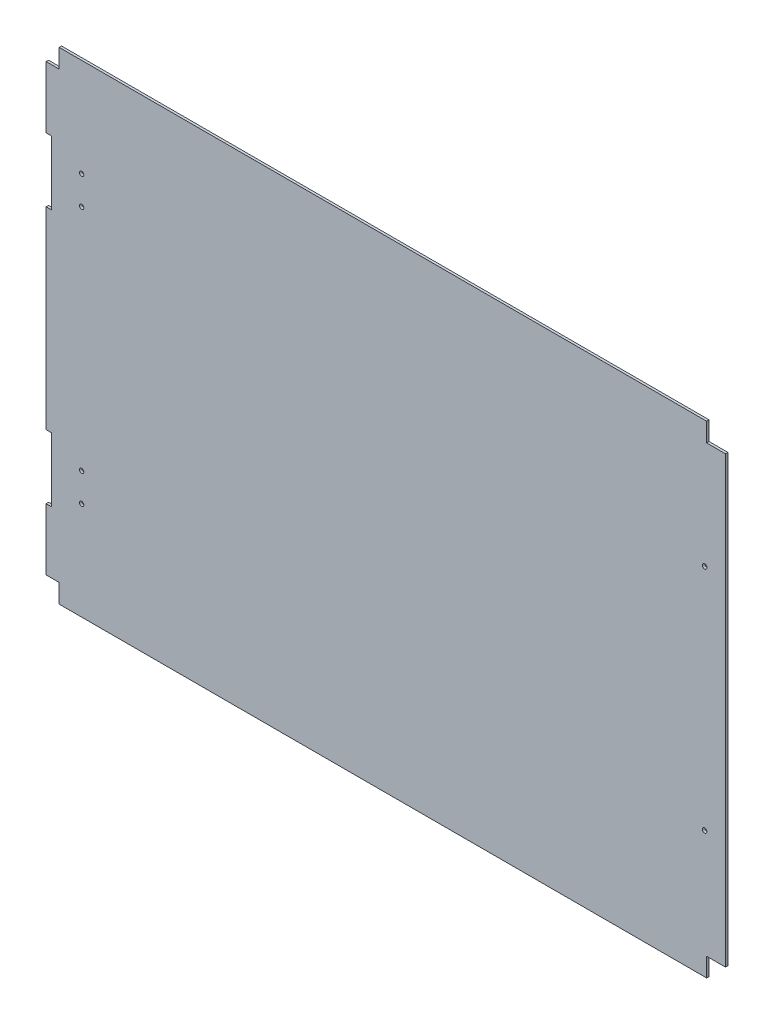
ISO-10303-21;
HEADER;
FILE_DESCRIPTION(('STEP AP214'),'2;1');
FILE_NAME('part.step','',(''),(''),'','','');
FILE_SCHEMA(('AUTOMOTIVE_DESIGN { 1 0 10303 214 1 1 1 1 }'));
ENDSEC;
DATA;
#1=APPLICATION_CONTEXT('core data for automotive mechanical design processes');
#2=APPLICATION_PROTOCOL_DEFINITION('international standard','automotive_design',2000,#1);
#3=PRODUCT_CONTEXT('',#1,'mechanical');
#4=PRODUCT('Part','Part','',(#3));
#5=PRODUCT_RELATED_PRODUCT_CATEGORY('part','',(#4));
#6=PRODUCT_DEFINITION_FORMATION('','',#4);
#7=PRODUCT_DEFINITION_CONTEXT('part definition',#1,'design');
#8=PRODUCT_DEFINITION('design','',#6,#7);
#9=PRODUCT_DEFINITION_SHAPE('','',#8);
#10=(LENGTH_UNIT() NAMED_UNIT(*) SI_UNIT(.MILLI.,.METRE.));
#11=(NAMED_UNIT(*) PLANE_ANGLE_UNIT() SI_UNIT($,.RADIAN.));
#12=(NAMED_UNIT(*) SI_UNIT($,.STERADIAN.) SOLID_ANGLE_UNIT());
#13=UNCERTAINTY_MEASURE_WITH_UNIT(LENGTH_MEASURE(1.E-05),#10,'distance_accuracy_value','');
#14=(GEOMETRIC_REPRESENTATION_CONTEXT(3) GLOBAL_UNCERTAINTY_ASSIGNED_CONTEXT((#13)) GLOBAL_UNIT_ASSIGNED_CONTEXT((#10,
#11,#12)) REPRESENTATION_CONTEXT('',''));
#15=CARTESIAN_POINT('',(0.,0.,0.));
#16=DIRECTION('',(0.,0.,1.));
#17=DIRECTION('',(1.,0.,0.));
#18=AXIS2_PLACEMENT_3D('',#15,#16,#17);
#19=CARTESIAN_POINT('',(359.537,253.238,-19.05));
#20=DIRECTION('',(-1.,0.,0.));
#21=DIRECTION('',(0.,0.,1.));
#22=AXIS2_PLACEMENT_3D('',#19,#20,#21);
#23=PLANE('',#22);
#24=DIRECTION('',(0.,1.,0.));
#25=VECTOR('',#24,1.);
#26=CARTESIAN_POINT('',(359.537,0.,-2.667));
#27=LINE('',#26,#25);
#28=CARTESIAN_POINT('',(359.537,246.888,-2.667));
#29=VERTEX_POINT('',#28);
#30=CARTESIAN_POINT('',(359.537,267.778291291236,-2.66699999999986));
#31=VERTEX_POINT('',#30);
#32=EDGE_CURVE('E290',#29,#31,#27,.T.);
#33=ORIENTED_EDGE('',*,*,#32,.T.);
#34=DIRECTION('',(0.,0.,-1.));
#35=VECTOR('',#34,1.);
#36=CARTESIAN_POINT('',(359.537,267.778291291236,0.));
#37=LINE('',#36,#35);
#38=CARTESIAN_POINT('',(359.537,267.778291291236,0.));
#39=VERTEX_POINT('',#38);
#40=EDGE_CURVE('E288',#39,#31,#37,.T.);
#41=ORIENTED_EDGE('',*,*,#40,.F.);
#42=DIRECTION('',(0.,-1.,0.));
#43=VECTOR('',#42,1.);
#44=CARTESIAN_POINT('',(359.537,253.238,0.));
#45=LINE('',#44,#43);
#46=CARTESIAN_POINT('',(359.537,246.888,0.));
#47=VERTEX_POINT('',#46);
#48=EDGE_CURVE('E276',#39,#47,#45,.T.);
#49=ORIENTED_EDGE('',*,*,#48,.T.);
#50=DIRECTION('',(0.,0.,1.));
#51=VECTOR('',#50,1.);
#52=CARTESIAN_POINT('',(359.537,246.888,-19.05));
#53=LINE('',#52,#51);
#54=EDGE_CURVE('E486',#29,#47,#53,.T.);
#55=ORIENTED_EDGE('',*,*,#54,.F.);
#56=EDGE_LOOP('',(#33,#41,#49,#55));
#57=FACE_BOUND('',#56,.T.);
#58=ADVANCED_FACE('F136',(#57),#23,.F.);
#59=CARTESIAN_POINT('',(365.887,246.888,-19.05));
#60=DIRECTION('',(0.,-1.,0.));
#61=DIRECTION('',(0.,0.,-1.));
#62=AXIS2_PLACEMENT_3D('',#59,#60,#61);
#63=PLANE('',#62);
#64=DIRECTION('',(1.,0.,0.));
#65=VECTOR('',#64,1.);
#66=CARTESIAN_POINT('',(365.887,246.888,0.));
#67=LINE('',#66,#65);
#68=CARTESIAN_POINT('',(380.427291291236,246.888,1.11022302462516E-13));
#69=VERTEX_POINT('',#68);
#70=EDGE_CURVE('E282',#47,#69,#67,.T.);
#71=ORIENTED_EDGE('',*,*,#70,.T.);
#72=DIRECTION('',(0.,0.,1.));
#73=VECTOR('',#72,1.);
#74=CARTESIAN_POINT('',(380.427291291236,246.888,1.11022302462516E-13));
#75=LINE('',#74,#73);
#76=CARTESIAN_POINT('',(380.427291291236,246.888,-2.66699999999986));
#77=VERTEX_POINT('',#76);
#78=EDGE_CURVE('E318',#77,#69,#75,.T.);
#79=ORIENTED_EDGE('',*,*,#78,.F.);
#80=DIRECTION('',(-1.,0.,0.));
#81=VECTOR('',#80,1.);
#82=CARTESIAN_POINT('',(0.,246.888,-2.667));
#83=LINE('',#82,#81);
#84=EDGE_CURVE('E152',#77,#29,#83,.T.);
#85=ORIENTED_EDGE('',*,*,#84,.T.);
#86=ORIENTED_EDGE('',*,*,#54,.T.);
#87=EDGE_LOOP('',(#71,#79,#85,#86));
#88=FACE_BOUND('',#87,.T.);
#89=ADVANCED_FACE('F564',(#88),#63,.F.);
#90=CARTESIAN_POINT('',(365.887,-246.888,-19.05));
#91=DIRECTION('',(0.,1.,0.));
#92=DIRECTION('',(0.,0.,1.));
#93=AXIS2_PLACEMENT_3D('',#90,#91,#92);
#94=PLANE('',#93);
#95=DIRECTION('',(1.,0.,0.));
#96=VECTOR('',#95,1.);
#97=CARTESIAN_POINT('',(0.,-246.888,-2.667));
#98=LINE('',#97,#96);
#99=CARTESIAN_POINT('',(359.537,-246.888,-2.667));
#100=VERTEX_POINT('',#99);
#101=CARTESIAN_POINT('',(380.427291291236,-246.888,-2.66699999999986));
#102=VERTEX_POINT('',#101);
#103=EDGE_CURVE('E502',#100,#102,#98,.T.);
#104=ORIENTED_EDGE('',*,*,#103,.T.);
#105=DIRECTION('',(0.,0.,-1.));
#106=VECTOR('',#105,1.);
#107=CARTESIAN_POINT('',(380.427291291236,-246.888,0.));
#108=LINE('',#107,#106);
#109=CARTESIAN_POINT('',(380.427291291236,-246.888,0.));
#110=VERTEX_POINT('',#109);
#111=EDGE_CURVE('E301',#110,#102,#108,.T.);
#112=ORIENTED_EDGE('',*,*,#111,.F.);
#113=DIRECTION('',(-1.,0.,0.));
#114=VECTOR('',#113,1.);
#115=CARTESIAN_POINT('',(365.887,-246.888,0.));
#116=LINE('',#115,#114);
#117=CARTESIAN_POINT('',(359.537,-246.888,0.));
#118=VERTEX_POINT('',#117);
#119=EDGE_CURVE('E468',#110,#118,#116,.T.);
#120=ORIENTED_EDGE('',*,*,#119,.T.);
#121=DIRECTION('',(0.,0.,1.));
#122=VECTOR('',#121,1.);
#123=CARTESIAN_POINT('',(359.537,-246.888,-19.05));
#124=LINE('',#123,#122);
#125=EDGE_CURVE('E473',#100,#118,#124,.T.);
#126=ORIENTED_EDGE('',*,*,#125,.F.);
#127=EDGE_LOOP('',(#104,#112,#120,#126));
#128=FACE_BOUND('',#127,.T.);
#129=ADVANCED_FACE('F568',(#128),#94,.F.);
#130=CARTESIAN_POINT('',(359.537,-253.238,-19.05));
#131=DIRECTION('',(-1.,0.,0.));
#132=DIRECTION('',(0.,-1.,0.));
#133=AXIS2_PLACEMENT_3D('',#130,#131,#132);
#134=PLANE('',#133);
#135=DIRECTION('',(0.,-1.,0.));
#136=VECTOR('',#135,1.);
#137=CARTESIAN_POINT('',(359.537,-253.238,0.));
#138=LINE('',#137,#136);
#139=CARTESIAN_POINT('',(359.537,-267.778291291236,1.11022302462516E-13));
#140=VERTEX_POINT('',#139);
#141=EDGE_CURVE('E476',#118,#140,#138,.T.);
#142=ORIENTED_EDGE('',*,*,#141,.T.);
#143=DIRECTION('',(0.,0.,1.));
#144=VECTOR('',#143,1.);
#145=CARTESIAN_POINT('',(359.537,-267.778291291236,2.22044604925031E-13));
#146=LINE('',#145,#144);
#147=CARTESIAN_POINT('',(359.537,-267.778291291236,-2.66699999999986));
#148=VERTEX_POINT('',#147);
#149=EDGE_CURVE('E334',#148,#140,#146,.T.);
#150=ORIENTED_EDGE('',*,*,#149,.F.);
#151=DIRECTION('',(0.,1.,0.));
#152=VECTOR('',#151,1.);
#153=CARTESIAN_POINT('',(359.536999999996,6.2860827654276E-12,-2.667));
#154=LINE('',#153,#152);
#155=EDGE_CURVE('E160',#148,#100,#154,.T.);
#156=ORIENTED_EDGE('',*,*,#155,.T.);
#157=ORIENTED_EDGE('',*,*,#125,.T.);
#158=EDGE_LOOP('',(#142,#150,#156,#157));
#159=FACE_BOUND('',#158,.T.);
#160=ADVANCED_FACE('F576',(#159),#134,.F.);
#161=CARTESIAN_POINT('',(-359.537,-253.238,-19.05));
#162=DIRECTION('',(1.,0.,0.));
#163=DIRECTION('',(0.,1.,0.));
#164=AXIS2_PLACEMENT_3D('',#161,#162,#163);
#165=PLANE('',#164);
#166=DIRECTION('',(0.,-1.,0.));
#167=VECTOR('',#166,1.);
#168=CARTESIAN_POINT('',(-359.536999999998,3.14304138271379E-12,-2.667));
#169=LINE('',#168,#167);
#170=CARTESIAN_POINT('',(-359.537,-246.888,-2.667));
#171=VERTEX_POINT('',#170);
#172=CARTESIAN_POINT('',(-359.537,-267.778291291236,-2.66699999999986));
#173=VERTEX_POINT('',#172);
#174=EDGE_CURVE('E495',#171,#173,#169,.T.);
#175=ORIENTED_EDGE('',*,*,#174,.T.);
#176=DIRECTION('',(0.,0.,-1.));
#177=VECTOR('',#176,1.);
#178=CARTESIAN_POINT('',(-359.537,-267.778291291236,0.));
#179=LINE('',#178,#177);
#180=CARTESIAN_POINT('',(-359.537,-267.778291291236,0.));
#181=VERTEX_POINT('',#180);
#182=EDGE_CURVE('E330',#181,#173,#179,.T.);
#183=ORIENTED_EDGE('',*,*,#182,.F.);
#184=DIRECTION('',(0.,1.,0.));
#185=VECTOR('',#184,1.);
#186=CARTESIAN_POINT('',(-359.537,-253.238,0.));
#187=LINE('',#186,#185);
#188=CARTESIAN_POINT('',(-359.537,-246.888,0.));
#189=VERTEX_POINT('',#188);
#190=EDGE_CURVE('E457',#181,#189,#187,.T.);
#191=ORIENTED_EDGE('',*,*,#190,.T.);
#192=DIRECTION('',(0.,0.,1.));
#193=VECTOR('',#192,1.);
#194=CARTESIAN_POINT('',(-359.537,-246.888,-19.05));
#195=LINE('',#194,#193);
#196=EDGE_CURVE('E463',#171,#189,#195,.T.);
#197=ORIENTED_EDGE('',*,*,#196,.F.);
#198=EDGE_LOOP('',(#175,#183,#191,#197));
#199=FACE_BOUND('',#198,.T.);
#200=ADVANCED_FACE('F579',(#199),#165,.F.);
#201=CARTESIAN_POINT('',(-365.887,-246.888,-19.05));
#202=DIRECTION('',(0.,1.,0.));
#203=DIRECTION('',(0.,0.,1.));
#204=AXIS2_PLACEMENT_3D('',#201,#202,#203);
#205=PLANE('',#204);
#206=DIRECTION('',(-1.,0.,0.));
#207=VECTOR('',#206,1.);
#208=CARTESIAN_POINT('',(-365.887,-246.888,0.));
#209=LINE('',#208,#207);
#210=CARTESIAN_POINT('',(-374.077291291236,-246.888,0.));
#211=VERTEX_POINT('',#210);
#212=EDGE_CURVE('E467',#189,#211,#209,.T.);
#213=ORIENTED_EDGE('',*,*,#212,.T.);
#214=DIRECTION('',(0.,0.,1.));
#215=VECTOR('',#214,1.);
#216=CARTESIAN_POINT('',(-374.077291291236,-246.888,0.));
#217=LINE('',#216,#215);
#218=CARTESIAN_POINT('',(-374.077291291236,-246.888,-2.66699999999992));
#219=VERTEX_POINT('',#218);
#220=EDGE_CURVE('E404',#219,#211,#217,.T.);
#221=ORIENTED_EDGE('',*,*,#220,.F.);
#222=DIRECTION('',(1.,0.,0.));
#223=VECTOR('',#222,1.);
#224=CARTESIAN_POINT('',(0.,-246.888,-2.667));
#225=LINE('',#224,#223);
#226=EDGE_CURVE('E492',#219,#171,#225,.T.);
#227=ORIENTED_EDGE('',*,*,#226,.T.);
#228=ORIENTED_EDGE('',*,*,#196,.T.);
#229=EDGE_LOOP('',(#213,#221,#227,#228));
#230=FACE_BOUND('',#229,.T.);
#231=ADVANCED_FACE('F582',(#230),#205,.F.);
#232=CARTESIAN_POINT('',(-365.887,246.888,-19.05));
#233=DIRECTION('',(0.,-1.,0.));
#234=DIRECTION('',(1.,0.,0.));
#235=AXIS2_PLACEMENT_3D('',#232,#233,#234);
#236=PLANE('',#235);
#237=DIRECTION('',(-1.,0.,0.));
#238=VECTOR('',#237,1.);
#239=CARTESIAN_POINT('',(-1.07913677993566E-12,246.888000000002,-2.667));
#240=LINE('',#239,#238);
#241=CARTESIAN_POINT('',(-359.537,246.888,-2.667));
#242=VERTEX_POINT('',#241);
#243=CARTESIAN_POINT('',(-374.077291291236,246.888,-2.66699999999992));
#244=VERTEX_POINT('',#243);
#245=EDGE_CURVE('E489',#242,#244,#240,.T.);
#246=ORIENTED_EDGE('',*,*,#245,.T.);
#247=DIRECTION('',(0.,0.,-1.));
#248=VECTOR('',#247,1.);
#249=CARTESIAN_POINT('',(-374.077291291236,246.888,2.22044604925031E-12));
#250=LINE('',#249,#248);
#251=CARTESIAN_POINT('',(-374.077291291236,246.888,1.11022302462516E-13));
#252=VERTEX_POINT('',#251);
#253=EDGE_CURVE('E392',#252,#244,#250,.T.);
#254=ORIENTED_EDGE('',*,*,#253,.F.);
#255=DIRECTION('',(1.,0.,0.));
#256=VECTOR('',#255,1.);
#257=CARTESIAN_POINT('',(-365.887,246.888,0.));
#258=LINE('',#257,#256);
#259=CARTESIAN_POINT('',(-359.537,246.888,0.));
#260=VERTEX_POINT('',#259);
#261=EDGE_CURVE('E285',#252,#260,#258,.T.);
#262=ORIENTED_EDGE('',*,*,#261,.T.);
#263=DIRECTION('',(0.,0.,1.));
#264=VECTOR('',#263,1.);
#265=CARTESIAN_POINT('',(-359.537,246.888,-19.05));
#266=LINE('',#265,#264);
#267=EDGE_CURVE('E453',#242,#260,#266,.T.);
#268=ORIENTED_EDGE('',*,*,#267,.F.);
#269=EDGE_LOOP('',(#246,#254,#262,#268));
#270=FACE_BOUND('',#269,.T.);
#271=ADVANCED_FACE('F573',(#270),#236,.F.);
#272=CARTESIAN_POINT('',(-359.537,253.238,-19.05));
#273=DIRECTION('',(1.,0.,0.));
#274=DIRECTION('',(0.,1.,0.));
#275=AXIS2_PLACEMENT_3D('',#272,#273,#274);
#276=PLANE('',#275);
#277=DIRECTION('',(0.,1.,0.));
#278=VECTOR('',#277,1.);
#279=CARTESIAN_POINT('',(-359.537,253.238,0.));
#280=LINE('',#279,#278);
#281=CARTESIAN_POINT('',(-359.537,267.778291291236,0.));
#282=VERTEX_POINT('',#281);
#283=EDGE_CURVE('E456',#260,#282,#280,.T.);
#284=ORIENTED_EDGE('',*,*,#283,.T.);
#285=DIRECTION('',(0.,0.,1.));
#286=VECTOR('',#285,1.);
#287=CARTESIAN_POINT('',(-359.537,267.778291291236,1.66533453693773E-13));
#288=LINE('',#287,#286);
#289=CARTESIAN_POINT('',(-359.537,267.778291291236,-2.66699999999986));
#290=VERTEX_POINT('',#289);
#291=EDGE_CURVE('E295',#290,#282,#288,.T.);
#292=ORIENTED_EDGE('',*,*,#291,.F.);
#293=DIRECTION('',(0.,-1.,0.));
#294=VECTOR('',#293,1.);
#295=CARTESIAN_POINT('',(-359.536999999998,-3.14304138271379E-12,-2.667));
#296=LINE('',#295,#294);
#297=EDGE_CURVE('E507',#290,#242,#296,.T.);
#298=ORIENTED_EDGE('',*,*,#297,.T.);
#299=ORIENTED_EDGE('',*,*,#267,.T.);
#300=EDGE_LOOP('',(#284,#292,#298,#299));
#301=FACE_BOUND('',#300,.T.);
#302=ADVANCED_FACE('F536',(#301),#276,.F.);
#303=CARTESIAN_POINT('',(0.,0.,-2.667));
#304=DIRECTION('',(0.,0.,-1.));
#305=DIRECTION('',(-1.,0.,0.));
#306=AXIS2_PLACEMENT_3D('',#303,#304,#305);
#307=PLANE('',#306);
#308=CARTESIAN_POINT('',(-334.645,127.,-2.667));
#309=DIRECTION('',(0.,0.,-1.));
#310=DIRECTION('',(-1.,0.,0.));
#311=AXIS2_PLACEMENT_3D('',#308,#309,#310);
#312=CIRCLE('',#311,2.413);
#313=CARTESIAN_POINT('',(-337.058,127.,-2.667));
#314=VERTEX_POINT('',#313);
#315=EDGE_CURVE('E13',#314,#314,#312,.T.);
#316=ORIENTED_EDGE('',*,*,#315,.F.);
#317=EDGE_LOOP('',(#316));
#318=FACE_BOUND('',#317,.T.);
#319=CARTESIAN_POINT('',(-334.645,-127.,-2.667));
#320=DIRECTION('',(0.,0.,-1.));
#321=DIRECTION('',(-1.,0.,0.));
#322=AXIS2_PLACEMENT_3D('',#319,#320,#321);
#323=CIRCLE('',#322,2.413);
#324=CARTESIAN_POINT('',(-337.058,-127.,-2.667));
#325=VERTEX_POINT('',#324);
#326=EDGE_CURVE('E145',#325,#325,#323,.T.);
#327=ORIENTED_EDGE('',*,*,#326,.F.);
#328=EDGE_LOOP('',(#327));
#329=FACE_BOUND('',#328,.T.);
#330=CARTESIAN_POINT('',(-334.645,-158.75,-2.667));
#331=DIRECTION('',(0.,0.,-1.));
#332=DIRECTION('',(-1.,0.,0.));
#333=AXIS2_PLACEMENT_3D('',#330,#331,#332);
#334=CIRCLE('',#333,2.413);
#335=CARTESIAN_POINT('',(-337.058,-158.75,-2.667));
#336=VERTEX_POINT('',#335);
#337=EDGE_CURVE('E522',#336,#336,#334,.T.);
#338=ORIENTED_EDGE('',*,*,#337,.F.);
#339=EDGE_LOOP('',(#338));
#340=FACE_BOUND('',#339,.T.);
#341=CARTESIAN_POINT('',(357.251,127.,-2.667));
#342=DIRECTION('',(0.,0.,-1.));
#343=DIRECTION('',(-1.,0.,0.));
#344=AXIS2_PLACEMENT_3D('',#341,#342,#343);
#345=CIRCLE('',#344,2.54000000000001);
#346=CARTESIAN_POINT('',(354.711,127.,-2.667));
#347=VERTEX_POINT('',#346);
#348=EDGE_CURVE('E518',#347,#347,#345,.T.);
#349=ORIENTED_EDGE('',*,*,#348,.F.);
#350=EDGE_LOOP('',(#349));
#351=FACE_BOUND('',#350,.T.);
#352=CARTESIAN_POINT('',(-334.645,158.75,-2.667));
#353=DIRECTION('',(0.,0.,-1.));
#354=DIRECTION('',(-1.,0.,0.));
#355=AXIS2_PLACEMENT_3D('',#352,#353,#354);
#356=CIRCLE('',#355,2.413);
#357=CARTESIAN_POINT('',(-337.058,158.75,-2.667));
#358=VERTEX_POINT('',#357);
#359=EDGE_CURVE('E514',#358,#358,#356,.T.);
#360=ORIENTED_EDGE('',*,*,#359,.F.);
#361=EDGE_LOOP('',(#360));
#362=FACE_BOUND('',#361,.T.);
#363=ORIENTED_EDGE('',*,*,#155,.F.);
#364=DIRECTION('',(-1.,0.,0.));
#365=VECTOR('',#364,1.);
#366=CARTESIAN_POINT('',(365.887,-267.778291291236,-2.66699999999986));
#367=LINE('',#366,#365);
#368=EDGE_CURVE('E317',#173,#148,#367,.F.);
#369=ORIENTED_EDGE('',*,*,#368,.F.);
#370=ORIENTED_EDGE('',*,*,#174,.F.);
#371=ORIENTED_EDGE('',*,*,#226,.F.);
#372=DIRECTION('',(0.,1.,0.));
#373=VECTOR('',#372,1.);
#374=CARTESIAN_POINT('',(-374.077291291236,-247.904,-2.66699999999992));
#375=LINE('',#374,#373);
#376=CARTESIAN_POINT('',(-374.077291291236,-178.308,-2.66699999999992));
#377=VERTEX_POINT('',#376);
#378=EDGE_CURVE('E405',#377,#219,#375,.F.);
#379=ORIENTED_EDGE('',*,*,#378,.F.);
#380=DIRECTION('',(1.,0.,0.));
#381=VECTOR('',#380,1.);
#382=CARTESIAN_POINT('',(-374.077291291236,-178.308,-2.66699999999992));
#383=LINE('',#382,#381);
#384=CARTESIAN_POINT('',(-368.235291291236,-178.308,-2.66700000000009));
#385=VERTEX_POINT('',#384);
#386=EDGE_CURVE('E356',#377,#385,#383,.T.);
#387=ORIENTED_EDGE('',*,*,#386,.T.);
#388=DIRECTION('',(0.,1.,0.));
#389=VECTOR('',#388,1.);
#390=CARTESIAN_POINT('',(-368.235291291236,-178.308,-2.66700000000009));
#391=LINE('',#390,#389);
#392=CARTESIAN_POINT('',(-368.235291291236,-107.188,-2.66700000000009));
#393=VERTEX_POINT('',#392);
#394=EDGE_CURVE('E352',#385,#393,#391,.T.);
#395=ORIENTED_EDGE('',*,*,#394,.T.);
#396=DIRECTION('',(-1.,0.,0.));
#397=VECTOR('',#396,1.);
#398=CARTESIAN_POINT('',(-374.077291291236,-107.188,-2.66699999999992));
#399=LINE('',#398,#397);
#400=CARTESIAN_POINT('',(-374.077291291236,-107.188,-2.66699999999992));
#401=VERTEX_POINT('',#400);
#402=EDGE_CURVE('E348',#393,#401,#399,.T.);
#403=ORIENTED_EDGE('',*,*,#402,.T.);
#404=CARTESIAN_POINT('',(-374.077291291236,107.188,-2.66699999999992));
#405=VERTEX_POINT('',#404);
#406=EDGE_CURVE('E329',#405,#401,#375,.F.);
#407=ORIENTED_EDGE('',*,*,#406,.F.);
#408=DIRECTION('',(1.,0.,0.));
#409=VECTOR('',#408,1.);
#410=CARTESIAN_POINT('',(-374.077291291236,107.188,-2.66699999999992));
#411=LINE('',#410,#409);
#412=CARTESIAN_POINT('',(-368.235291291236,107.188,-2.66700000000009));
#413=VERTEX_POINT('',#412);
#414=EDGE_CURVE('E368',#405,#413,#411,.T.);
#415=ORIENTED_EDGE('',*,*,#414,.T.);
#416=DIRECTION('',(0.,1.,0.));
#417=VECTOR('',#416,1.);
#418=CARTESIAN_POINT('',(-368.235291291236,178.308,-2.66700000000009));
#419=LINE('',#418,#417);
#420=CARTESIAN_POINT('',(-368.235291291236,178.308,-2.66700000000009));
#421=VERTEX_POINT('',#420);
#422=EDGE_CURVE('E364',#413,#421,#419,.T.);
#423=ORIENTED_EDGE('',*,*,#422,.T.);
#424=DIRECTION('',(-1.,0.,0.));
#425=VECTOR('',#424,1.);
#426=CARTESIAN_POINT('',(-374.077291291236,178.308,-2.66699999999992));
#427=LINE('',#426,#425);
#428=CARTESIAN_POINT('',(-374.077291291236,178.308,-2.66699999999992));
#429=VERTEX_POINT('',#428);
#430=EDGE_CURVE('E360',#421,#429,#427,.T.);
#431=ORIENTED_EDGE('',*,*,#430,.T.);
#432=EDGE_CURVE('E400',#244,#429,#375,.F.);
#433=ORIENTED_EDGE('',*,*,#432,.F.);
#434=ORIENTED_EDGE('',*,*,#245,.F.);
#435=ORIENTED_EDGE('',*,*,#297,.F.);
#436=DIRECTION('',(1.,0.,0.));
#437=VECTOR('',#436,1.);
#438=CARTESIAN_POINT('',(-365.887,267.778291291236,-2.66699999999986));
#439=LINE('',#438,#437);
#440=EDGE_CURVE('E311',#31,#290,#439,.F.);
#441=ORIENTED_EDGE('',*,*,#440,.F.);
#442=ORIENTED_EDGE('',*,*,#32,.F.);
#443=ORIENTED_EDGE('',*,*,#84,.F.);
#444=DIRECTION('',(0.,-1.,0.));
#445=VECTOR('',#444,1.);
#446=CARTESIAN_POINT('',(380.427291291236,253.238,-2.66699999999986));
#447=LINE('',#446,#445);
#448=EDGE_CURVE('E306',#102,#77,#447,.F.);
#449=ORIENTED_EDGE('',*,*,#448,.F.);
#450=ORIENTED_EDGE('',*,*,#103,.F.);
#451=EDGE_LOOP('',(#363,#369,#370,#371,#379,#387,#395,#403,#407,#415,#423,#431,#433,#434,#435,
#441,#442,#443,#449,#450));
#452=FACE_BOUND('',#451,.T.);
#453=CARTESIAN_POINT('',(357.251,-127.,-2.667));
#454=DIRECTION('',(0.,0.,-1.));
#455=DIRECTION('',(-1.,0.,0.));
#456=AXIS2_PLACEMENT_3D('',#453,#454,#455);
#457=CIRCLE('',#456,2.54000000000001);
#458=CARTESIAN_POINT('',(354.711,-127.,-2.667));
#459=VERTEX_POINT('',#458);
#460=EDGE_CURVE('E510',#459,#459,#457,.T.);
#461=ORIENTED_EDGE('',*,*,#460,.F.);
#462=EDGE_LOOP('',(#461));
#463=FACE_BOUND('',#462,.T.);
#464=ADVANCED_FACE('F533',(#318,#329,#340,#351,#362,#452,#463),#307,.T.);
#465=CARTESIAN_POINT('',(0.,0.,0.));
#466=DIRECTION('',(0.,0.,-1.));
#467=DIRECTION('',(-1.,0.,0.));
#468=AXIS2_PLACEMENT_3D('',#465,#466,#467);
#469=PLANE('',#468);
#470=CARTESIAN_POINT('',(-334.645,127.,0.));
#471=DIRECTION('',(0.,0.,1.));
#472=DIRECTION('',(1.,0.,0.));
#473=AXIS2_PLACEMENT_3D('',#470,#471,#472);
#474=CIRCLE('',#473,2.413);
#475=CARTESIAN_POINT('',(-332.232,127.,0.));
#476=VERTEX_POINT('',#475);
#477=EDGE_CURVE('E445',#476,#476,#474,.T.);
#478=ORIENTED_EDGE('',*,*,#477,.F.);
#479=EDGE_LOOP('',(#478));
#480=FACE_BOUND('',#479,.T.);
#481=CARTESIAN_POINT('',(-334.645,-127.,0.));
#482=DIRECTION('',(0.,0.,1.));
#483=DIRECTION('',(1.,0.,0.));
#484=AXIS2_PLACEMENT_3D('',#481,#482,#483);
#485=CIRCLE('',#484,2.413);
#486=CARTESIAN_POINT('',(-332.232,-127.,0.));
#487=VERTEX_POINT('',#486);
#488=EDGE_CURVE('E441',#487,#487,#485,.T.);
#489=ORIENTED_EDGE('',*,*,#488,.F.);
#490=EDGE_LOOP('',(#489));
#491=FACE_BOUND('',#490,.T.);
#492=CARTESIAN_POINT('',(-334.645,-158.75,0.));
#493=DIRECTION('',(0.,0.,1.));
#494=DIRECTION('',(1.,0.,0.));
#495=AXIS2_PLACEMENT_3D('',#492,#493,#494);
#496=CIRCLE('',#495,2.413);
#497=CARTESIAN_POINT('',(-332.232,-158.75,0.));
#498=VERTEX_POINT('',#497);
#499=EDGE_CURVE('E437',#498,#498,#496,.T.);
#500=ORIENTED_EDGE('',*,*,#499,.F.);
#501=EDGE_LOOP('',(#500));
#502=FACE_BOUND('',#501,.T.);
#503=CARTESIAN_POINT('',(357.251,127.,0.));
#504=DIRECTION('',(0.,0.,1.));
#505=DIRECTION('',(1.,0.,0.));
#506=AXIS2_PLACEMENT_3D('',#503,#504,#505);
#507=CIRCLE('',#506,2.54000000000001);
#508=CARTESIAN_POINT('',(359.791,127.,0.));
#509=VERTEX_POINT('',#508);
#510=EDGE_CURVE('E436',#509,#509,#507,.T.);
#511=ORIENTED_EDGE('',*,*,#510,.F.);
#512=EDGE_LOOP('',(#511));
#513=FACE_BOUND('',#512,.T.);
#514=CARTESIAN_POINT('',(-334.645,158.75,0.));
#515=DIRECTION('',(0.,0.,1.));
#516=DIRECTION('',(1.,0.,0.));
#517=AXIS2_PLACEMENT_3D('',#514,#515,#516);
#518=CIRCLE('',#517,2.413);
#519=CARTESIAN_POINT('',(-332.232,158.75,0.));
#520=VERTEX_POINT('',#519);
#521=EDGE_CURVE('E449',#520,#520,#518,.T.);
#522=ORIENTED_EDGE('',*,*,#521,.F.);
#523=EDGE_LOOP('',(#522));
#524=FACE_BOUND('',#523,.T.);
#525=CARTESIAN_POINT('',(357.251,-127.,0.));
#526=DIRECTION('',(0.,0.,1.));
#527=DIRECTION('',(1.,0.,0.));
#528=AXIS2_PLACEMENT_3D('',#525,#526,#527);
#529=CIRCLE('',#528,2.54000000000001);
#530=CARTESIAN_POINT('',(359.791,-127.,0.));
#531=VERTEX_POINT('',#530);
#532=EDGE_CURVE('E345',#531,#531,#529,.T.);
#533=ORIENTED_EDGE('',*,*,#532,.F.);
#534=EDGE_LOOP('',(#533));
#535=FACE_BOUND('',#534,.T.);
#536=ORIENTED_EDGE('',*,*,#190,.F.);
#537=DIRECTION('',(1.,0.,0.));
#538=VECTOR('',#537,1.);
#539=CARTESIAN_POINT('',(0.,-267.778291291236,1.11022302462516E-13));
#540=LINE('',#539,#538);
#541=EDGE_CURVE('E325',#181,#140,#540,.T.);
#542=ORIENTED_EDGE('',*,*,#541,.T.);
#543=ORIENTED_EDGE('',*,*,#141,.F.);
#544=ORIENTED_EDGE('',*,*,#119,.F.);
#545=DIRECTION('',(0.,1.,0.));
#546=VECTOR('',#545,1.);
#547=CARTESIAN_POINT('',(380.427291291236,0.,1.11022302462516E-13));
#548=LINE('',#547,#546);
#549=EDGE_CURVE('E314',#110,#69,#548,.T.);
#550=ORIENTED_EDGE('',*,*,#549,.T.);
#551=ORIENTED_EDGE('',*,*,#70,.F.);
#552=ORIENTED_EDGE('',*,*,#48,.F.);
#553=DIRECTION('',(-1.,0.,0.));
#554=VECTOR('',#553,1.);
#555=CARTESIAN_POINT('',(0.,267.778291291236,1.11022302462516E-13));
#556=LINE('',#555,#554);
#557=EDGE_CURVE('E280',#39,#282,#556,.T.);
#558=ORIENTED_EDGE('',*,*,#557,.T.);
#559=ORIENTED_EDGE('',*,*,#283,.F.);
#560=ORIENTED_EDGE('',*,*,#261,.F.);
#561=DIRECTION('',(0.,-1.,0.));
#562=VECTOR('',#561,1.);
#563=CARTESIAN_POINT('',(-374.077291291236,0.,0.));
#564=LINE('',#563,#562);
#565=CARTESIAN_POINT('',(-374.077291291236,178.308,0.));
#566=VERTEX_POINT('',#565);
#567=EDGE_CURVE('E341',#252,#566,#564,.T.);
#568=ORIENTED_EDGE('',*,*,#567,.T.);
#569=DIRECTION('',(-1.,0.,0.));
#570=VECTOR('',#569,1.);
#571=CARTESIAN_POINT('',(-374.077291291236,178.308,0.));
#572=LINE('',#571,#570);
#573=CARTESIAN_POINT('',(-368.235291291236,178.308,0.));
#574=VERTEX_POINT('',#573);
#575=EDGE_CURVE('E386',#574,#566,#572,.T.);
#576=ORIENTED_EDGE('',*,*,#575,.F.);
#577=DIRECTION('',(0.,1.,0.));
#578=VECTOR('',#577,1.);
#579=CARTESIAN_POINT('',(-368.235291291236,178.308,0.));
#580=LINE('',#579,#578);
#581=CARTESIAN_POINT('',(-368.235291291236,107.188,0.));
#582=VERTEX_POINT('',#581);
#583=EDGE_CURVE('E379',#582,#574,#580,.T.);
#584=ORIENTED_EDGE('',*,*,#583,.F.);
#585=DIRECTION('',(1.,0.,0.));
#586=VECTOR('',#585,1.);
#587=CARTESIAN_POINT('',(-374.077291291236,107.188,0.));
#588=LINE('',#587,#586);
#589=CARTESIAN_POINT('',(-374.077291291236,107.188,0.));
#590=VERTEX_POINT('',#589);
#591=EDGE_CURVE('E372',#590,#582,#588,.T.);
#592=ORIENTED_EDGE('',*,*,#591,.F.);
#593=CARTESIAN_POINT('',(-374.077291291236,-107.188,0.));
#594=VERTEX_POINT('',#593);
#595=EDGE_CURVE('E347',#590,#594,#564,.T.);
#596=ORIENTED_EDGE('',*,*,#595,.T.);
#597=DIRECTION('',(-1.,0.,0.));
#598=VECTOR('',#597,1.);
#599=CARTESIAN_POINT('',(-374.077291291236,-107.188,0.));
#600=LINE('',#599,#598);
#601=CARTESIAN_POINT('',(-368.235291291236,-107.188,0.));
#602=VERTEX_POINT('',#601);
#603=EDGE_CURVE('E423',#602,#594,#600,.T.);
#604=ORIENTED_EDGE('',*,*,#603,.F.);
#605=DIRECTION('',(0.,1.,0.));
#606=VECTOR('',#605,1.);
#607=CARTESIAN_POINT('',(-368.235291291236,-178.308,0.));
#608=LINE('',#607,#606);
#609=CARTESIAN_POINT('',(-368.235291291236,-178.308,0.));
#610=VERTEX_POINT('',#609);
#611=EDGE_CURVE('E416',#610,#602,#608,.T.);
#612=ORIENTED_EDGE('',*,*,#611,.F.);
#613=DIRECTION('',(1.,0.,0.));
#614=VECTOR('',#613,1.);
#615=CARTESIAN_POINT('',(-374.077291291236,-178.308,0.));
#616=LINE('',#615,#614);
#617=CARTESIAN_POINT('',(-374.077291291236,-178.308,0.));
#618=VERTEX_POINT('',#617);
#619=EDGE_CURVE('E409',#618,#610,#616,.T.);
#620=ORIENTED_EDGE('',*,*,#619,.F.);
#621=EDGE_CURVE('E346',#618,#211,#564,.T.);
#622=ORIENTED_EDGE('',*,*,#621,.T.);
#623=ORIENTED_EDGE('',*,*,#212,.F.);
#624=EDGE_LOOP('',(#536,#542,#543,#544,#550,#551,#552,#558,#559,#560,#568,#576,#584,#592,#596,
#604,#612,#620,#622,#623));
#625=FACE_BOUND('',#624,.T.);
#626=ADVANCED_FACE('F138',(#480,#491,#502,#513,#524,#535,#625),#469,.F.);
#627=CARTESIAN_POINT('',(357.251,-127.,-19.05));
#628=DIRECTION('',(0.,0.,1.));
#629=DIRECTION('',(1.,0.,0.));
#630=AXIS2_PLACEMENT_3D('',#627,#628,#629);
#631=CYLINDRICAL_SURFACE('',#630,2.54000000000001);
#632=ORIENTED_EDGE('',*,*,#460,.T.);
#633=EDGE_LOOP('',(#632));
#634=FACE_BOUND('',#633,.T.);
#635=ORIENTED_EDGE('',*,*,#532,.T.);
#636=EDGE_LOOP('',(#635));
#637=FACE_BOUND('',#636,.T.);
#638=ADVANCED_FACE('F550',(#634,#637),#631,.F.);
#639=CARTESIAN_POINT('',(-334.645,158.75,-19.05));
#640=DIRECTION('',(0.,0.,1.));
#641=DIRECTION('',(1.,0.,0.));
#642=AXIS2_PLACEMENT_3D('',#639,#640,#641);
#643=CYLINDRICAL_SURFACE('',#642,2.413);
#644=ORIENTED_EDGE('',*,*,#359,.T.);
#645=EDGE_LOOP('',(#644));
#646=FACE_BOUND('',#645,.T.);
#647=ORIENTED_EDGE('',*,*,#521,.T.);
#648=EDGE_LOOP('',(#647));
#649=FACE_BOUND('',#648,.T.);
#650=ADVANCED_FACE('F553',(#646,#649),#643,.F.);
#651=CARTESIAN_POINT('',(357.251,127.,-19.05));
#652=DIRECTION('',(0.,0.,1.));
#653=DIRECTION('',(1.,0.,0.));
#654=AXIS2_PLACEMENT_3D('',#651,#652,#653);
#655=CYLINDRICAL_SURFACE('',#654,2.54000000000001);
#656=ORIENTED_EDGE('',*,*,#348,.T.);
#657=EDGE_LOOP('',(#656));
#658=FACE_BOUND('',#657,.T.);
#659=ORIENTED_EDGE('',*,*,#510,.T.);
#660=EDGE_LOOP('',(#659));
#661=FACE_BOUND('',#660,.T.);
#662=ADVANCED_FACE('F594',(#658,#661),#655,.F.);
#663=CARTESIAN_POINT('',(-334.645,-158.75,-19.05));
#664=DIRECTION('',(0.,0.,1.));
#665=DIRECTION('',(1.,0.,0.));
#666=AXIS2_PLACEMENT_3D('',#663,#664,#665);
#667=CYLINDRICAL_SURFACE('',#666,2.413);
#668=ORIENTED_EDGE('',*,*,#337,.T.);
#669=EDGE_LOOP('',(#668));
#670=FACE_BOUND('',#669,.T.);
#671=ORIENTED_EDGE('',*,*,#499,.T.);
#672=EDGE_LOOP('',(#671));
#673=FACE_BOUND('',#672,.T.);
#674=ADVANCED_FACE('F599',(#670,#673),#667,.F.);
#675=CARTESIAN_POINT('',(-334.645,-127.,-19.05));
#676=DIRECTION('',(0.,0.,1.));
#677=DIRECTION('',(1.,0.,0.));
#678=AXIS2_PLACEMENT_3D('',#675,#676,#677);
#679=CYLINDRICAL_SURFACE('',#678,2.413);
#680=ORIENTED_EDGE('',*,*,#326,.T.);
#681=EDGE_LOOP('',(#680));
#682=FACE_BOUND('',#681,.T.);
#683=ORIENTED_EDGE('',*,*,#488,.T.);
#684=EDGE_LOOP('',(#683));
#685=FACE_BOUND('',#684,.T.);
#686=ADVANCED_FACE('F530',(#682,#685),#679,.F.);
#687=CARTESIAN_POINT('',(-334.645,127.,-19.05));
#688=DIRECTION('',(0.,0.,1.));
#689=DIRECTION('',(1.,0.,0.));
#690=AXIS2_PLACEMENT_3D('',#687,#688,#689);
#691=CYLINDRICAL_SURFACE('',#690,2.413);
#692=ORIENTED_EDGE('',*,*,#315,.T.);
#693=EDGE_LOOP('',(#692));
#694=FACE_BOUND('',#693,.T.);
#695=ORIENTED_EDGE('',*,*,#477,.T.);
#696=EDGE_LOOP('',(#695));
#697=FACE_BOUND('',#696,.T.);
#698=ADVANCED_FACE('F598',(#694,#697),#691,.F.);
#699=CARTESIAN_POINT('',(-374.077291291236,-247.904,0.));
#700=DIRECTION('',(1.,0.,0.));
#701=DIRECTION('',(0.,0.,-1.));
#702=AXIS2_PLACEMENT_3D('',#699,#700,#701);
#703=PLANE('',#702);
#704=ORIENTED_EDGE('',*,*,#595,.F.);
#705=DIRECTION('',(0.,0.,1.));
#706=VECTOR('',#705,1.);
#707=CARTESIAN_POINT('',(-374.077291291243,107.188,-731.775));
#708=LINE('',#707,#706);
#709=EDGE_CURVE('E376',#405,#590,#708,.T.);
#710=ORIENTED_EDGE('',*,*,#709,.F.);
#711=ORIENTED_EDGE('',*,*,#406,.T.);
#712=DIRECTION('',(0.,0.,1.));
#713=VECTOR('',#712,1.);
#714=CARTESIAN_POINT('',(-374.077291291243,-107.188,-731.775));
#715=LINE('',#714,#713);
#716=EDGE_CURVE('E429',#401,#594,#715,.T.);
#717=ORIENTED_EDGE('',*,*,#716,.T.);
#718=EDGE_LOOP('',(#704,#710,#711,#717));
#719=FACE_BOUND('',#718,.T.);
#720=ADVANCED_FACE('F602',(#719),#703,.F.);
#721=CARTESIAN_POINT('',(-374.077291291243,-107.188,-731.775));
#722=DIRECTION('',(0.,1.,0.));
#723=DIRECTION('',(1.,0.,0.));
#724=AXIS2_PLACEMENT_3D('',#721,#722,#723);
#725=PLANE('',#724);
#726=DIRECTION('',(0.,0.,1.));
#727=VECTOR('',#726,1.);
#728=CARTESIAN_POINT('',(-368.235291291243,-107.188,-731.775));
#729=LINE('',#728,#727);
#730=EDGE_CURVE('E426',#393,#602,#729,.T.);
#731=ORIENTED_EDGE('',*,*,#730,.T.);
#732=ORIENTED_EDGE('',*,*,#603,.T.);
#733=ORIENTED_EDGE('',*,*,#716,.F.);
#734=ORIENTED_EDGE('',*,*,#402,.F.);
#735=EDGE_LOOP('',(#731,#732,#733,#734));
#736=FACE_BOUND('',#735,.T.);
#737=ADVANCED_FACE('F632',(#736),#725,.F.);
#738=CARTESIAN_POINT('',(-368.235291291243,-178.308,-731.775));
#739=DIRECTION('',(1.,0.,0.));
#740=DIRECTION('',(0.,0.,-1.));
#741=AXIS2_PLACEMENT_3D('',#738,#739,#740);
#742=PLANE('',#741);
#743=DIRECTION('',(0.,0.,1.));
#744=VECTOR('',#743,1.);
#745=CARTESIAN_POINT('',(-368.235291291243,-178.308,-731.775));
#746=LINE('',#745,#744);
#747=EDGE_CURVE('E420',#385,#610,#746,.T.);
#748=ORIENTED_EDGE('',*,*,#747,.T.);
#749=ORIENTED_EDGE('',*,*,#611,.T.);
#750=ORIENTED_EDGE('',*,*,#730,.F.);
#751=ORIENTED_EDGE('',*,*,#394,.F.);
#752=EDGE_LOOP('',(#748,#749,#750,#751));
#753=FACE_BOUND('',#752,.T.);
#754=ADVANCED_FACE('F628',(#753),#742,.F.);
#755=CARTESIAN_POINT('',(-374.077291291243,-178.308,-731.775));
#756=DIRECTION('',(0.,-1.,0.));
#757=DIRECTION('',(-1.,0.,0.));
#758=AXIS2_PLACEMENT_3D('',#755,#756,#757);
#759=PLANE('',#758);
#760=DIRECTION('',(0.,0.,1.));
#761=VECTOR('',#760,1.);
#762=CARTESIAN_POINT('',(-374.077291291243,-178.308,-731.775));
#763=LINE('',#762,#761);
#764=EDGE_CURVE('E413',#377,#618,#763,.T.);
#765=ORIENTED_EDGE('',*,*,#764,.T.);
#766=ORIENTED_EDGE('',*,*,#619,.T.);
#767=ORIENTED_EDGE('',*,*,#747,.F.);
#768=ORIENTED_EDGE('',*,*,#386,.F.);
#769=EDGE_LOOP('',(#765,#766,#767,#768));
#770=FACE_BOUND('',#769,.T.);
#771=ADVANCED_FACE('F624',(#770),#759,.F.);
#772=ORIENTED_EDGE('',*,*,#621,.F.);
#773=ORIENTED_EDGE('',*,*,#764,.F.);
#774=ORIENTED_EDGE('',*,*,#378,.T.);
#775=ORIENTED_EDGE('',*,*,#220,.T.);
#776=EDGE_LOOP('',(#772,#773,#774,#775));
#777=FACE_BOUND('',#776,.T.);
#778=ADVANCED_FACE('F627',(#777),#703,.F.);
#779=ORIENTED_EDGE('',*,*,#432,.T.);
#780=DIRECTION('',(0.,0.,1.));
#781=VECTOR('',#780,1.);
#782=CARTESIAN_POINT('',(-374.077291291243,178.308,-731.775));
#783=LINE('',#782,#781);
#784=EDGE_CURVE('E396',#429,#566,#783,.T.);
#785=ORIENTED_EDGE('',*,*,#784,.T.);
#786=ORIENTED_EDGE('',*,*,#567,.F.);
#787=ORIENTED_EDGE('',*,*,#253,.T.);
#788=EDGE_LOOP('',(#779,#785,#786,#787));
#789=FACE_BOUND('',#788,.T.);
#790=ADVANCED_FACE('F622',(#789),#703,.F.);
#791=CARTESIAN_POINT('',(-374.077291291243,178.308,-731.775));
#792=DIRECTION('',(0.,1.,0.));
#793=DIRECTION('',(1.,0.,0.));
#794=AXIS2_PLACEMENT_3D('',#791,#792,#793);
#795=PLANE('',#794);
#796=DIRECTION('',(0.,0.,1.));
#797=VECTOR('',#796,1.);
#798=CARTESIAN_POINT('',(-368.235291291243,178.308,-731.775));
#799=LINE('',#798,#797);
#800=EDGE_CURVE('E389',#421,#574,#799,.T.);
#801=ORIENTED_EDGE('',*,*,#800,.T.);
#802=ORIENTED_EDGE('',*,*,#575,.T.);
#803=ORIENTED_EDGE('',*,*,#784,.F.);
#804=ORIENTED_EDGE('',*,*,#430,.F.);
#805=EDGE_LOOP('',(#801,#802,#803,#804));
#806=FACE_BOUND('',#805,.T.);
#807=ADVANCED_FACE('F618',(#806),#795,.F.);
#808=CARTESIAN_POINT('',(-368.235291291243,178.308,-731.775));
#809=DIRECTION('',(1.,0.,0.));
#810=DIRECTION('',(0.,0.,-1.));
#811=AXIS2_PLACEMENT_3D('',#808,#809,#810);
#812=PLANE('',#811);
#813=DIRECTION('',(0.,0.,1.));
#814=VECTOR('',#813,1.);
#815=CARTESIAN_POINT('',(-368.235291291243,107.188,-731.775));
#816=LINE('',#815,#814);
#817=EDGE_CURVE('E383',#413,#582,#816,.T.);
#818=ORIENTED_EDGE('',*,*,#817,.T.);
#819=ORIENTED_EDGE('',*,*,#583,.T.);
#820=ORIENTED_EDGE('',*,*,#800,.F.);
#821=ORIENTED_EDGE('',*,*,#422,.F.);
#822=EDGE_LOOP('',(#818,#819,#820,#821));
#823=FACE_BOUND('',#822,.T.);
#824=ADVANCED_FACE('F614',(#823),#812,.F.);
#825=CARTESIAN_POINT('',(-374.077291291243,107.188,-731.775));
#826=DIRECTION('',(0.,-1.,0.));
#827=DIRECTION('',(-1.,0.,0.));
#828=AXIS2_PLACEMENT_3D('',#825,#826,#827);
#829=PLANE('',#828);
#830=ORIENTED_EDGE('',*,*,#709,.T.);
#831=ORIENTED_EDGE('',*,*,#591,.T.);
#832=ORIENTED_EDGE('',*,*,#817,.F.);
#833=ORIENTED_EDGE('',*,*,#414,.F.);
#834=EDGE_LOOP('',(#830,#831,#832,#833));
#835=FACE_BOUND('',#834,.T.);
#836=ADVANCED_FACE('F610',(#835),#829,.F.);
#837=CARTESIAN_POINT('',(365.887,-267.778291291236,1.11022302462516E-13));
#838=DIRECTION('',(0.,1.,0.));
#839=DIRECTION('',(0.,0.,1.));
#840=AXIS2_PLACEMENT_3D('',#837,#838,#839);
#841=PLANE('',#840);
#842=ORIENTED_EDGE('',*,*,#368,.T.);
#843=ORIENTED_EDGE('',*,*,#149,.T.);
#844=ORIENTED_EDGE('',*,*,#541,.F.);
#845=ORIENTED_EDGE('',*,*,#182,.T.);
#846=EDGE_LOOP('',(#842,#843,#844,#845));
#847=FACE_BOUND('',#846,.T.);
#848=ADVANCED_FACE('F613',(#847),#841,.F.);
#849=CARTESIAN_POINT('',(380.427291291236,253.238,1.11022302462516E-13));
#850=DIRECTION('',(-1.,0.,0.));
#851=DIRECTION('',(0.,0.,1.));
#852=AXIS2_PLACEMENT_3D('',#849,#850,#851);
#853=PLANE('',#852);
#854=ORIENTED_EDGE('',*,*,#549,.F.);
#855=ORIENTED_EDGE('',*,*,#111,.T.);
#856=ORIENTED_EDGE('',*,*,#448,.T.);
#857=ORIENTED_EDGE('',*,*,#78,.T.);
#858=EDGE_LOOP('',(#854,#855,#856,#857));
#859=FACE_BOUND('',#858,.T.);
#860=ADVANCED_FACE('F642',(#859),#853,.F.);
#861=CARTESIAN_POINT('',(-365.887,267.778291291236,1.11022302462516E-13));
#862=DIRECTION('',(0.,-1.,0.));
#863=DIRECTION('',(0.,0.,-1.));
#864=AXIS2_PLACEMENT_3D('',#861,#862,#863);
#865=PLANE('',#864);
#866=ORIENTED_EDGE('',*,*,#440,.T.);
#867=ORIENTED_EDGE('',*,*,#291,.T.);
#868=ORIENTED_EDGE('',*,*,#557,.F.);
#869=ORIENTED_EDGE('',*,*,#40,.T.);
#870=EDGE_LOOP('',(#866,#867,#868,#869));
#871=FACE_BOUND('',#870,.T.);
#872=ADVANCED_FACE('F298',(#871),#865,.F.);
#873=CLOSED_SHELL('',(#58,#89,#129,#160,#200,#231,#271,#302,#464,#626,#638,#650,#662,#674,#686,
#698,#720,#737,#754,#771,#778,#790,#807,#824,#836,#848,#860,#872));
#874=MANIFOLD_SOLID_BREP('B2',#873);
#875=ADVANCED_BREP_SHAPE_REPRESENTATION('',(#18,#874),#14);
#876=SHAPE_DEFINITION_REPRESENTATION(#9,#875);
ENDSEC;
END-ISO-10303-21;
